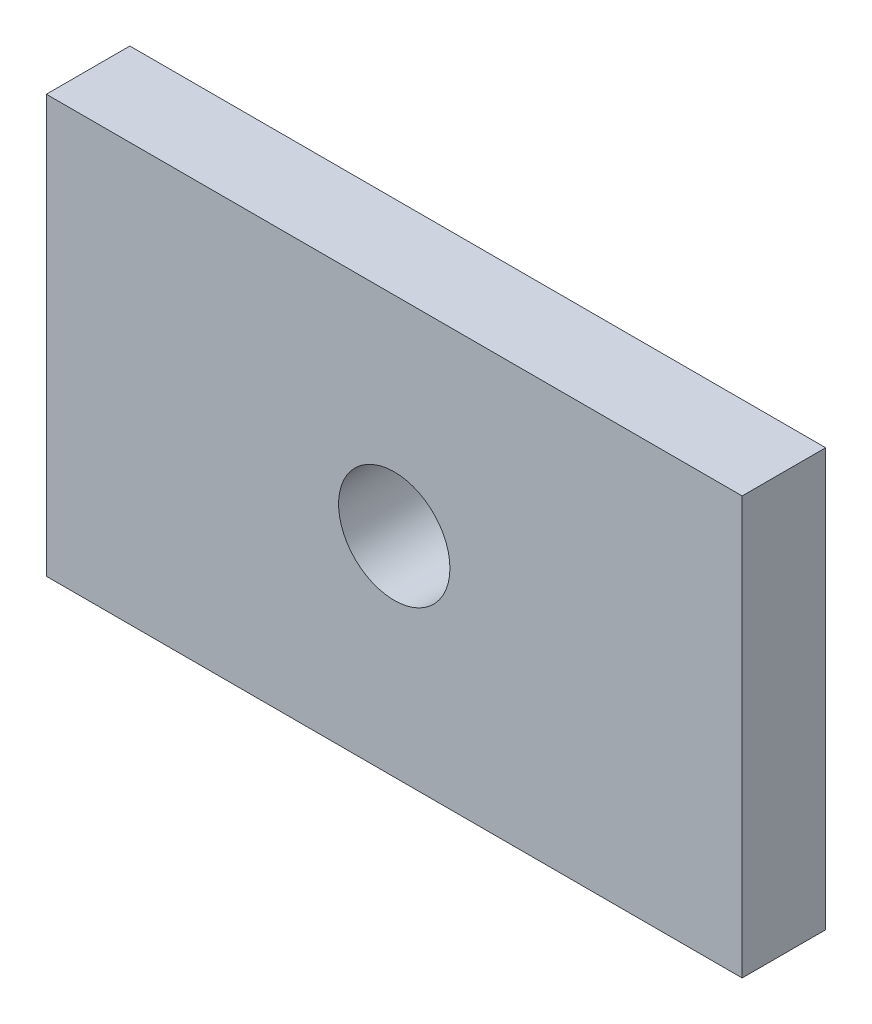
ISO-10303-21;
HEADER;
FILE_DESCRIPTION(('STEP AP214'),'2;1');
FILE_NAME('part.step','',(''),(''),'','','');
FILE_SCHEMA(('AUTOMOTIVE_DESIGN { 1 0 10303 214 1 1 1 1 }'));
ENDSEC;
DATA;
#1=APPLICATION_CONTEXT('core data for automotive mechanical design processes');
#2=APPLICATION_PROTOCOL_DEFINITION('international standard','automotive_design',2000,#1);
#3=PRODUCT_CONTEXT('',#1,'mechanical');
#4=PRODUCT('Part','Part','',(#3));
#5=PRODUCT_RELATED_PRODUCT_CATEGORY('part','',(#4));
#6=PRODUCT_DEFINITION_FORMATION('','',#4);
#7=PRODUCT_DEFINITION_CONTEXT('part definition',#1,'design');
#8=PRODUCT_DEFINITION('design','',#6,#7);
#9=PRODUCT_DEFINITION_SHAPE('','',#8);
#10=(LENGTH_UNIT() NAMED_UNIT(*) SI_UNIT(.MILLI.,.METRE.));
#11=(NAMED_UNIT(*) PLANE_ANGLE_UNIT() SI_UNIT($,.RADIAN.));
#12=(NAMED_UNIT(*) SI_UNIT($,.STERADIAN.) SOLID_ANGLE_UNIT());
#13=UNCERTAINTY_MEASURE_WITH_UNIT(LENGTH_MEASURE(1.E-05),#10,'distance_accuracy_value','');
#14=(GEOMETRIC_REPRESENTATION_CONTEXT(3) GLOBAL_UNCERTAINTY_ASSIGNED_CONTEXT((#13)) GLOBAL_UNIT_ASSIGNED_CONTEXT((#10,
#11,#12)) REPRESENTATION_CONTEXT('',''));
#15=CARTESIAN_POINT('',(0.,0.,0.));
#16=DIRECTION('',(0.,0.,1.));
#17=DIRECTION('',(1.,0.,0.));
#18=AXIS2_PLACEMENT_3D('',#15,#16,#17);
#19=CARTESIAN_POINT('',(0.,0.,3.));
#20=DIRECTION('',(0.,0.,1.));
#21=DIRECTION('',(1.,0.,0.));
#22=AXIS2_PLACEMENT_3D('',#19,#20,#21);
#23=PLANE('',#22);
#24=DIRECTION('',(0.,1.,0.));
#25=VECTOR('',#24,1.);
#26=CARTESIAN_POINT('',(0.,0.,3.));
#27=LINE('',#26,#25);
#28=CARTESIAN_POINT('',(0.,0.,3.));
#29=VERTEX_POINT('',#28);
#30=CARTESIAN_POINT('',(0.,15.,3.));
#31=VERTEX_POINT('',#30);
#32=EDGE_CURVE('E91',#29,#31,#27,.T.);
#33=ORIENTED_EDGE('',*,*,#32,.T.);
#34=DIRECTION('',(-1.,0.,0.));
#35=VECTOR('',#34,1.);
#36=CARTESIAN_POINT('',(0.,15.,3.));
#37=LINE('',#36,#35);
#38=CARTESIAN_POINT('',(-25.,15.,3.));
#39=VERTEX_POINT('',#38);
#40=EDGE_CURVE('E86',#31,#39,#37,.T.);
#41=ORIENTED_EDGE('',*,*,#40,.T.);
#42=DIRECTION('',(0.,-1.,0.));
#43=VECTOR('',#42,1.);
#44=CARTESIAN_POINT('',(-25.,0.,3.));
#45=LINE('',#44,#43);
#46=CARTESIAN_POINT('',(-25.,0.,3.));
#47=VERTEX_POINT('',#46);
#48=EDGE_CURVE('E89',#39,#47,#45,.T.);
#49=ORIENTED_EDGE('',*,*,#48,.T.);
#50=DIRECTION('',(1.,0.,0.));
#51=VECTOR('',#50,1.);
#52=CARTESIAN_POINT('',(0.,0.,3.));
#53=LINE('',#52,#51);
#54=EDGE_CURVE('E56',#47,#29,#53,.T.);
#55=ORIENTED_EDGE('',*,*,#54,.T.);
#56=EDGE_LOOP('',(#33,#41,#49,#55));
#57=FACE_BOUND('',#56,.T.);
#58=CARTESIAN_POINT('',(-12.5,7.5,3.));
#59=DIRECTION('',(0.,0.,1.));
#60=DIRECTION('',(1.,0.,0.));
#61=AXIS2_PLACEMENT_3D('',#58,#59,#60);
#62=CIRCLE('',#61,2.);
#63=CARTESIAN_POINT('',(-10.5,7.5,3.));
#64=VERTEX_POINT('',#63);
#65=EDGE_CURVE('E106',#64,#64,#62,.T.);
#66=ORIENTED_EDGE('',*,*,#65,.F.);
#67=EDGE_LOOP('',(#66));
#68=FACE_BOUND('',#67,.T.);
#69=ADVANCED_FACE('F39',(#57,#68),#23,.T.);
#70=CARTESIAN_POINT('',(0.,0.,0.));
#71=DIRECTION('',(0.,0.,1.));
#72=DIRECTION('',(1.,0.,0.));
#73=AXIS2_PLACEMENT_3D('',#70,#71,#72);
#74=PLANE('',#73);
#75=DIRECTION('',(0.,1.,0.));
#76=VECTOR('',#75,1.);
#77=CARTESIAN_POINT('',(0.,0.,0.));
#78=LINE('',#77,#76);
#79=CARTESIAN_POINT('',(0.,0.,0.));
#80=VERTEX_POINT('',#79);
#81=CARTESIAN_POINT('',(0.,15.,0.));
#82=VERTEX_POINT('',#81);
#83=EDGE_CURVE('E103',#80,#82,#78,.T.);
#84=ORIENTED_EDGE('',*,*,#83,.F.);
#85=DIRECTION('',(1.,0.,0.));
#86=VECTOR('',#85,1.);
#87=CARTESIAN_POINT('',(0.,0.,0.));
#88=LINE('',#87,#86);
#89=CARTESIAN_POINT('',(-25.,0.,0.));
#90=VERTEX_POINT('',#89);
#91=EDGE_CURVE('E79',#90,#80,#88,.T.);
#92=ORIENTED_EDGE('',*,*,#91,.F.);
#93=DIRECTION('',(0.,-1.,0.));
#94=VECTOR('',#93,1.);
#95=CARTESIAN_POINT('',(-25.,0.,0.));
#96=LINE('',#95,#94);
#97=CARTESIAN_POINT('',(-25.,15.,0.));
#98=VERTEX_POINT('',#97);
#99=EDGE_CURVE('E73',#98,#90,#96,.T.);
#100=ORIENTED_EDGE('',*,*,#99,.F.);
#101=DIRECTION('',(-1.,0.,0.));
#102=VECTOR('',#101,1.);
#103=CARTESIAN_POINT('',(0.,15.,0.));
#104=LINE('',#103,#102);
#105=EDGE_CURVE('E95',#82,#98,#104,.T.);
#106=ORIENTED_EDGE('',*,*,#105,.F.);
#107=EDGE_LOOP('',(#84,#92,#100,#106));
#108=FACE_BOUND('',#107,.T.);
#109=CARTESIAN_POINT('',(-12.5,7.5,0.));
#110=DIRECTION('',(0.,0.,1.));
#111=DIRECTION('',(1.,0.,0.));
#112=AXIS2_PLACEMENT_3D('',#109,#110,#111);
#113=CIRCLE('',#112,2.);
#114=CARTESIAN_POINT('',(-10.5,7.5,0.));
#115=VERTEX_POINT('',#114);
#116=EDGE_CURVE('E118',#115,#115,#113,.T.);
#117=ORIENTED_EDGE('',*,*,#116,.T.);
#118=EDGE_LOOP('',(#117));
#119=FACE_BOUND('',#118,.T.);
#120=ADVANCED_FACE('F114',(#108,#119),#74,.F.);
#121=CARTESIAN_POINT('',(0.,0.,3.));
#122=DIRECTION('',(-1.,0.,0.));
#123=DIRECTION('',(0.,0.,1.));
#124=AXIS2_PLACEMENT_3D('',#121,#122,#123);
#125=PLANE('',#124);
#126=ORIENTED_EDGE('',*,*,#83,.T.);
#127=DIRECTION('',(0.,0.,-1.));
#128=VECTOR('',#127,1.);
#129=CARTESIAN_POINT('',(0.,15.,3.));
#130=LINE('',#129,#128);
#131=EDGE_CURVE('E11',#31,#82,#130,.T.);
#132=ORIENTED_EDGE('',*,*,#131,.F.);
#133=ORIENTED_EDGE('',*,*,#32,.F.);
#134=DIRECTION('',(0.,0.,-1.));
#135=VECTOR('',#134,1.);
#136=CARTESIAN_POINT('',(0.,0.,3.));
#137=LINE('',#136,#135);
#138=EDGE_CURVE('E99',#29,#80,#137,.T.);
#139=ORIENTED_EDGE('',*,*,#138,.T.);
#140=EDGE_LOOP('',(#126,#132,#133,#139));
#141=FACE_BOUND('',#140,.T.);
#142=ADVANCED_FACE('F41',(#141),#125,.F.);
#143=CARTESIAN_POINT('',(0.,15.,3.));
#144=DIRECTION('',(0.,-1.,0.));
#145=DIRECTION('',(1.,0.,0.));
#146=AXIS2_PLACEMENT_3D('',#143,#144,#145);
#147=PLANE('',#146);
#148=ORIENTED_EDGE('',*,*,#105,.T.);
#149=DIRECTION('',(0.,0.,-1.));
#150=VECTOR('',#149,1.);
#151=CARTESIAN_POINT('',(-25.,15.,3.));
#152=LINE('',#151,#150);
#153=EDGE_CURVE('E48',#39,#98,#152,.T.);
#154=ORIENTED_EDGE('',*,*,#153,.F.);
#155=ORIENTED_EDGE('',*,*,#40,.F.);
#156=ORIENTED_EDGE('',*,*,#131,.T.);
#157=EDGE_LOOP('',(#148,#154,#155,#156));
#158=FACE_BOUND('',#157,.T.);
#159=ADVANCED_FACE('F94',(#158),#147,.F.);
#160=CARTESIAN_POINT('',(-25.,0.,3.));
#161=DIRECTION('',(1.,0.,0.));
#162=DIRECTION('',(0.,0.,-1.));
#163=AXIS2_PLACEMENT_3D('',#160,#161,#162);
#164=PLANE('',#163);
#165=ORIENTED_EDGE('',*,*,#99,.T.);
#166=DIRECTION('',(0.,0.,-1.));
#167=VECTOR('',#166,1.);
#168=CARTESIAN_POINT('',(-25.,0.,3.));
#169=LINE('',#168,#167);
#170=EDGE_CURVE('E96',#47,#90,#169,.T.);
#171=ORIENTED_EDGE('',*,*,#170,.F.);
#172=ORIENTED_EDGE('',*,*,#48,.F.);
#173=ORIENTED_EDGE('',*,*,#153,.T.);
#174=EDGE_LOOP('',(#165,#171,#172,#173));
#175=FACE_BOUND('',#174,.T.);
#176=ADVANCED_FACE('F97',(#175),#164,.F.);
#177=CARTESIAN_POINT('',(0.,0.,3.));
#178=DIRECTION('',(0.,1.,0.));
#179=DIRECTION('',(-1.,0.,0.));
#180=AXIS2_PLACEMENT_3D('',#177,#178,#179);
#181=PLANE('',#180);
#182=ORIENTED_EDGE('',*,*,#91,.T.);
#183=ORIENTED_EDGE('',*,*,#138,.F.);
#184=ORIENTED_EDGE('',*,*,#54,.F.);
#185=ORIENTED_EDGE('',*,*,#170,.T.);
#186=EDGE_LOOP('',(#182,#183,#184,#185));
#187=FACE_BOUND('',#186,.T.);
#188=ADVANCED_FACE('F111',(#187),#181,.F.);
#189=CARTESIAN_POINT('',(-12.5,7.5,3.));
#190=DIRECTION('',(0.,0.,-1.));
#191=DIRECTION('',(-1.,0.,0.));
#192=AXIS2_PLACEMENT_3D('',#189,#190,#191);
#193=CYLINDRICAL_SURFACE('',#192,2.);
#194=ORIENTED_EDGE('',*,*,#65,.T.);
#195=EDGE_LOOP('',(#194));
#196=FACE_BOUND('',#195,.T.);
#197=ORIENTED_EDGE('',*,*,#116,.F.);
#198=EDGE_LOOP('',(#197));
#199=FACE_BOUND('',#198,.T.);
#200=ADVANCED_FACE('F124',(#196,#199),#193,.F.);
#201=CLOSED_SHELL('',(#69,#120,#142,#159,#176,#188,#200));
#202=MANIFOLD_SOLID_BREP('B2',#201);
#203=ADVANCED_BREP_SHAPE_REPRESENTATION('',(#18,#202),#14);
#204=SHAPE_DEFINITION_REPRESENTATION(#9,#203);
ENDSEC;
END-ISO-10303-21;
